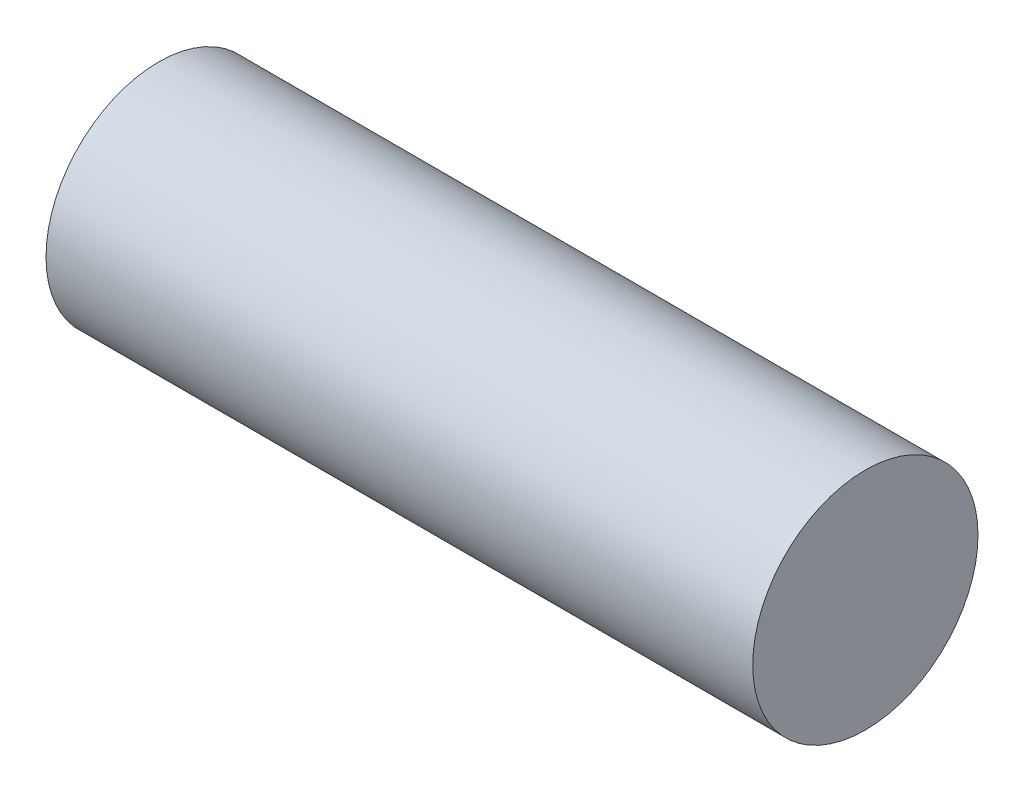
ISO-10303-21;
HEADER;
FILE_DESCRIPTION(('STEP AP214'),'2;1');
FILE_NAME('part.step','',(''),(''),'','','');
FILE_SCHEMA(('AUTOMOTIVE_DESIGN { 1 0 10303 214 1 1 1 1 }'));
ENDSEC;
DATA;
#1=APPLICATION_CONTEXT('core data for automotive mechanical design processes');
#2=APPLICATION_PROTOCOL_DEFINITION('international standard','automotive_design',2000,#1);
#3=PRODUCT_CONTEXT('',#1,'mechanical');
#4=PRODUCT('Part','Part','',(#3));
#5=PRODUCT_RELATED_PRODUCT_CATEGORY('part','',(#4));
#6=PRODUCT_DEFINITION_FORMATION('','',#4);
#7=PRODUCT_DEFINITION_CONTEXT('part definition',#1,'design');
#8=PRODUCT_DEFINITION('design','',#6,#7);
#9=PRODUCT_DEFINITION_SHAPE('','',#8);
#10=(LENGTH_UNIT() NAMED_UNIT(*) SI_UNIT(.MILLI.,.METRE.));
#11=(NAMED_UNIT(*) PLANE_ANGLE_UNIT() SI_UNIT($,.RADIAN.));
#12=(NAMED_UNIT(*) SI_UNIT($,.STERADIAN.) SOLID_ANGLE_UNIT());
#13=UNCERTAINTY_MEASURE_WITH_UNIT(LENGTH_MEASURE(1.E-05),#10,'distance_accuracy_value','');
#14=(GEOMETRIC_REPRESENTATION_CONTEXT(3) GLOBAL_UNCERTAINTY_ASSIGNED_CONTEXT((#13)) GLOBAL_UNIT_ASSIGNED_CONTEXT((#10,
#11,#12)) REPRESENTATION_CONTEXT('',''));
#15=CARTESIAN_POINT('',(0.,0.,0.));
#16=DIRECTION('',(0.,0.,1.));
#17=DIRECTION('',(1.,0.,0.));
#18=AXIS2_PLACEMENT_3D('',#15,#16,#17);
#19=CARTESIAN_POINT('',(0.,0.,-63.7499999999998));
#20=DIRECTION('',(-1.,0.,0.));
#21=DIRECTION('',(0.,0.,1.));
#22=AXIS2_PLACEMENT_3D('',#19,#20,#21);
#23=PLANE('',#22);
#24=CARTESIAN_POINT('',(0.,0.,-63.7499999999998));
#25=DIRECTION('',(-1.,0.,0.));
#26=DIRECTION('',(0.,0.,1.));
#27=AXIS2_PLACEMENT_3D('',#24,#25,#26);
#28=CIRCLE('',#27,63.7499999999998);
#29=CARTESIAN_POINT('',(0.,0.,0.));
#30=VERTEX_POINT('',#29);
#31=EDGE_CURVE('E10',#30,#30,#28,.T.);
#32=ORIENTED_EDGE('',*,*,#31,.T.);
#33=EDGE_LOOP('',(#32));
#34=FACE_BOUND('',#33,.T.);
#35=ADVANCED_FACE('F37',(#34),#23,.T.);
#36=CARTESIAN_POINT('',(400.,0.,-63.7499999999999));
#37=DIRECTION('',(-1.,0.,0.));
#38=DIRECTION('',(0.,0.,1.));
#39=AXIS2_PLACEMENT_3D('',#36,#37,#38);
#40=CYLINDRICAL_SURFACE('',#39,63.7499999999999);
#41=CARTESIAN_POINT('',(400.,0.,-63.7499999999999));
#42=DIRECTION('',(-1.,0.,0.));
#43=DIRECTION('',(0.,0.,1.));
#44=AXIS2_PLACEMENT_3D('',#41,#42,#43);
#45=CIRCLE('',#44,63.7499999999999);
#46=CARTESIAN_POINT('',(400.,0.,0.));
#47=VERTEX_POINT('',#46);
#48=EDGE_CURVE('E44',#47,#47,#45,.T.);
#49=ORIENTED_EDGE('',*,*,#48,.T.);
#50=EDGE_LOOP('',(#49));
#51=FACE_BOUND('',#50,.T.);
#52=ORIENTED_EDGE('',*,*,#31,.F.);
#53=EDGE_LOOP('',(#52));
#54=FACE_BOUND('',#53,.T.);
#55=ADVANCED_FACE('F51',(#51,#54),#40,.T.);
#56=CARTESIAN_POINT('',(400.,0.,0.));
#57=DIRECTION('',(1.,0.,0.));
#58=DIRECTION('',(0.,0.,-1.));
#59=AXIS2_PLACEMENT_3D('',#56,#57,#58);
#60=PLANE('',#59);
#61=ORIENTED_EDGE('',*,*,#48,.F.);
#62=EDGE_LOOP('',(#61));
#63=FACE_BOUND('',#62,.T.);
#64=ADVANCED_FACE('F54',(#63),#60,.T.);
#65=CLOSED_SHELL('',(#35,#55,#64));
#66=MANIFOLD_SOLID_BREP('B2',#65);
#67=ADVANCED_BREP_SHAPE_REPRESENTATION('',(#18,#66),#14);
#68=SHAPE_DEFINITION_REPRESENTATION(#9,#67);
ENDSEC;
END-ISO-10303-21;
